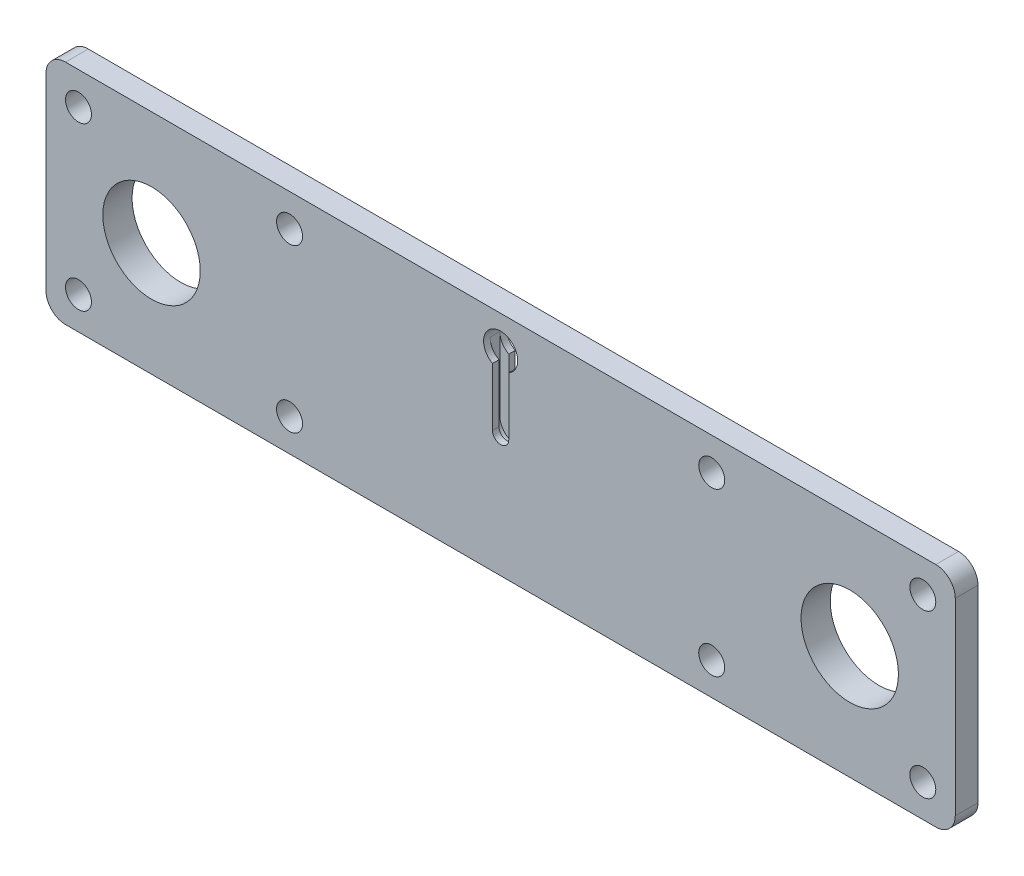
ISO-10303-21;
HEADER;
FILE_DESCRIPTION(('STEP AP214'),'2;1');
FILE_NAME('part.step','',(''),(''),'','','');
FILE_SCHEMA(('AUTOMOTIVE_DESIGN { 1 0 10303 214 1 1 1 1 }'));
ENDSEC;
DATA;
#1=APPLICATION_CONTEXT('core data for automotive mechanical design processes');
#2=APPLICATION_PROTOCOL_DEFINITION('international standard','automotive_design',2000,#1);
#3=PRODUCT_CONTEXT('',#1,'mechanical');
#4=PRODUCT('Part','Part','',(#3));
#5=PRODUCT_RELATED_PRODUCT_CATEGORY('part','',(#4));
#6=PRODUCT_DEFINITION_FORMATION('','',#4);
#7=PRODUCT_DEFINITION_CONTEXT('part definition',#1,'design');
#8=PRODUCT_DEFINITION('design','',#6,#7);
#9=PRODUCT_DEFINITION_SHAPE('','',#8);
#10=(LENGTH_UNIT() NAMED_UNIT(*) SI_UNIT(.MILLI.,.METRE.));
#11=(NAMED_UNIT(*) PLANE_ANGLE_UNIT() SI_UNIT($,.RADIAN.));
#12=(NAMED_UNIT(*) SI_UNIT($,.STERADIAN.) SOLID_ANGLE_UNIT());
#13=UNCERTAINTY_MEASURE_WITH_UNIT(LENGTH_MEASURE(1.E-05),#10,'distance_accuracy_value','');
#14=(GEOMETRIC_REPRESENTATION_CONTEXT(3) GLOBAL_UNCERTAINTY_ASSIGNED_CONTEXT((#13)) GLOBAL_UNIT_ASSIGNED_CONTEXT((#10,
#11,#12)) REPRESENTATION_CONTEXT('',''));
#15=CARTESIAN_POINT('',(0.,0.,0.));
#16=DIRECTION('',(0.,0.,1.));
#17=DIRECTION('',(1.,0.,0.));
#18=AXIS2_PLACEMENT_3D('',#15,#16,#17);
#19=CARTESIAN_POINT('',(0.,2.5,10.));
#20=DIRECTION('',(0.,0.,-1.));
#21=DIRECTION('',(-1.,0.,0.));
#22=AXIS2_PLACEMENT_3D('',#19,#20,#21);
#23=CYLINDRICAL_SURFACE('',#22,2.5);
#24=CARTESIAN_POINT('',(0.,2.5,5.));
#25=DIRECTION('',(0.,0.,-1.));
#26=DIRECTION('',(-1.,0.,0.));
#27=AXIS2_PLACEMENT_3D('',#24,#25,#26);
#28=CIRCLE('',#27,2.5);
#29=CARTESIAN_POINT('',(-2.5,2.5,5.));
#30=VERTEX_POINT('',#29);
#31=CARTESIAN_POINT('',(2.5,2.5,5.));
#32=VERTEX_POINT('',#31);
#33=EDGE_CURVE('E219',#30,#32,#28,.F.);
#34=ORIENTED_EDGE('',*,*,#33,.F.);
#35=DIRECTION('',(0.,0.,-1.));
#36=VECTOR('',#35,1.);
#37=CARTESIAN_POINT('',(-2.5,2.5,10.));
#38=LINE('',#37,#36);
#39=CARTESIAN_POINT('',(-2.5,2.5,7.));
#40=VERTEX_POINT('',#39);
#41=EDGE_CURVE('E266',#40,#30,#38,.T.);
#42=ORIENTED_EDGE('',*,*,#41,.F.);
#43=CARTESIAN_POINT('',(0.,2.5,7.));
#44=DIRECTION('',(0.,0.,1.));
#45=DIRECTION('',(1.,0.,0.));
#46=AXIS2_PLACEMENT_3D('',#43,#44,#45);
#47=CIRCLE('',#46,2.5);
#48=CARTESIAN_POINT('',(2.5,2.5,7.));
#49=VERTEX_POINT('',#48);
#50=EDGE_CURVE('E309',#40,#49,#47,.T.);
#51=ORIENTED_EDGE('',*,*,#50,.T.);
#52=DIRECTION('',(0.,0.,-1.));
#53=VECTOR('',#52,1.);
#54=CARTESIAN_POINT('',(2.5,2.5,10.));
#55=LINE('',#54,#53);
#56=EDGE_CURVE('E245',#49,#32,#55,.T.);
#57=ORIENTED_EDGE('',*,*,#56,.T.);
#58=EDGE_LOOP('',(#34,#42,#51,#57));
#59=FACE_BOUND('',#58,.T.);
#60=ADVANCED_FACE('F37',(#59),#23,.F.);
#61=CARTESIAN_POINT('',(2.5,2.5,10.));
#62=DIRECTION('',(1.,0.,0.));
#63=DIRECTION('',(0.,0.,-1.));
#64=AXIS2_PLACEMENT_3D('',#61,#62,#63);
#65=PLANE('',#64);
#66=DIRECTION('',(0.,1.,0.));
#67=VECTOR('',#66,1.);
#68=CARTESIAN_POINT('',(2.5,2.5,5.));
#69=LINE('',#68,#67);
#70=CARTESIAN_POINT('',(2.5,20.3834536718452,5.));
#71=VERTEX_POINT('',#70);
#72=EDGE_CURVE('E180',#32,#71,#69,.T.);
#73=ORIENTED_EDGE('',*,*,#72,.F.);
#74=ORIENTED_EDGE('',*,*,#56,.F.);
#75=DIRECTION('',(0.,1.,0.));
#76=VECTOR('',#75,1.);
#77=CARTESIAN_POINT('',(2.5,0.,7.));
#78=LINE('',#77,#76);
#79=CARTESIAN_POINT('',(2.5,20.3834536718452,7.));
#80=VERTEX_POINT('',#79);
#81=EDGE_CURVE('E307',#49,#80,#78,.T.);
#82=ORIENTED_EDGE('',*,*,#81,.T.);
#83=DIRECTION('',(0.,0.,-1.));
#84=VECTOR('',#83,1.);
#85=CARTESIAN_POINT('',(2.5,20.3834536718452,10.));
#86=LINE('',#85,#84);
#87=EDGE_CURVE('E261',#80,#71,#86,.T.);
#88=ORIENTED_EDGE('',*,*,#87,.T.);
#89=EDGE_LOOP('',(#73,#74,#82,#88));
#90=FACE_BOUND('',#89,.T.);
#91=ADVANCED_FACE('F421',(#90),#65,.F.);
#92=CARTESIAN_POINT('',(0.,25.,10.));
#93=DIRECTION('',(0.,0.,-1.));
#94=DIRECTION('',(-1.,0.,0.));
#95=AXIS2_PLACEMENT_3D('',#92,#93,#94);
#96=CYLINDRICAL_SURFACE('',#95,5.25);
#97=CARTESIAN_POINT('',(0.,25.,5.));
#98=DIRECTION('',(0.,0.,-1.));
#99=DIRECTION('',(-1.,0.,0.));
#100=AXIS2_PLACEMENT_3D('',#97,#98,#99);
#101=CIRCLE('',#100,5.25);
#102=CARTESIAN_POINT('',(-5.25,25.,5.));
#103=VERTEX_POINT('',#102);
#104=CARTESIAN_POINT('',(-2.5,20.3834536718452,5.));
#105=VERTEX_POINT('',#104);
#106=EDGE_CURVE('E187',#103,#105,#101,.F.);
#107=ORIENTED_EDGE('',*,*,#106,.F.);
#108=DIRECTION('',(0.,0.,-1.));
#109=VECTOR('',#108,1.);
#110=CARTESIAN_POINT('',(-5.25,25.,5.));
#111=LINE('',#110,#109);
#112=CARTESIAN_POINT('',(-5.25,25.,2.));
#113=VERTEX_POINT('',#112);
#114=EDGE_CURVE('E214',#103,#113,#111,.T.);
#115=ORIENTED_EDGE('',*,*,#114,.T.);
#116=CARTESIAN_POINT('',(0.,25.,2.));
#117=DIRECTION('',(0.,0.,-1.));
#118=DIRECTION('',(-1.,0.,0.));
#119=AXIS2_PLACEMENT_3D('',#116,#117,#118);
#120=CIRCLE('',#119,5.25);
#121=CARTESIAN_POINT('',(-2.5,20.3834536718452,2.));
#122=VERTEX_POINT('',#121);
#123=EDGE_CURVE('E211',#113,#122,#120,.F.);
#124=ORIENTED_EDGE('',*,*,#123,.T.);
#125=DIRECTION('',(0.,0.,-1.));
#126=VECTOR('',#125,1.);
#127=CARTESIAN_POINT('',(-2.5,20.3834536718452,10.));
#128=LINE('',#127,#126);
#129=CARTESIAN_POINT('',(-2.5,20.3834536718452,0.));
#130=VERTEX_POINT('',#129);
#131=EDGE_CURVE('E265',#122,#130,#128,.T.);
#132=ORIENTED_EDGE('',*,*,#131,.T.);
#133=CARTESIAN_POINT('',(0.,25.,0.));
#134=DIRECTION('',(0.,0.,-1.));
#135=DIRECTION('',(-1.,0.,0.));
#136=AXIS2_PLACEMENT_3D('',#133,#134,#135);
#137=CIRCLE('',#136,5.25);
#138=CARTESIAN_POINT('',(2.5,20.3834536718452,0.));
#139=VERTEX_POINT('',#138);
#140=EDGE_CURVE('E251',#130,#139,#137,.T.);
#141=ORIENTED_EDGE('',*,*,#140,.T.);
#142=CARTESIAN_POINT('',(2.5,20.3834536718452,2.));
#143=VERTEX_POINT('',#142);
#144=EDGE_CURVE('E263',#143,#139,#86,.T.);
#145=ORIENTED_EDGE('',*,*,#144,.F.);
#146=CARTESIAN_POINT('',(5.25,25.,2.));
#147=VERTEX_POINT('',#146);
#148=EDGE_CURVE('E202',#143,#147,#120,.F.);
#149=ORIENTED_EDGE('',*,*,#148,.T.);
#150=DIRECTION('',(0.,0.,-1.));
#151=VECTOR('',#150,1.);
#152=CARTESIAN_POINT('',(5.25,25.,5.));
#153=LINE('',#152,#151);
#154=CARTESIAN_POINT('',(5.25,25.,5.));
#155=VERTEX_POINT('',#154);
#156=EDGE_CURVE('E191',#155,#147,#153,.T.);
#157=ORIENTED_EDGE('',*,*,#156,.F.);
#158=EDGE_CURVE('E174',#71,#155,#101,.F.);
#159=ORIENTED_EDGE('',*,*,#158,.F.);
#160=ORIENTED_EDGE('',*,*,#87,.F.);
#161=CARTESIAN_POINT('',(0.,25.,7.));
#162=DIRECTION('',(0.,0.,1.));
#163=DIRECTION('',(1.,0.,0.));
#164=AXIS2_PLACEMENT_3D('',#161,#162,#163);
#165=CIRCLE('',#164,5.25);
#166=CARTESIAN_POINT('',(-2.5,20.3834536718452,7.));
#167=VERTEX_POINT('',#166);
#168=EDGE_CURVE('E305',#80,#167,#165,.T.);
#169=ORIENTED_EDGE('',*,*,#168,.T.);
#170=EDGE_CURVE('E60',#167,#105,#128,.T.);
#171=ORIENTED_EDGE('',*,*,#170,.T.);
#172=EDGE_LOOP('',(#107,#115,#124,#132,#141,#145,#149,#157,#159,#160,#169,#171));
#173=FACE_BOUND('',#172,.T.);
#174=ADVANCED_FACE('F200',(#173),#96,.F.);
#175=CARTESIAN_POINT('',(-2.5,2.5,10.));
#176=DIRECTION('',(-1.,0.,0.));
#177=DIRECTION('',(0.,0.,1.));
#178=AXIS2_PLACEMENT_3D('',#175,#176,#177);
#179=PLANE('',#178);
#180=DIRECTION('',(0.,-1.,0.));
#181=VECTOR('',#180,1.);
#182=CARTESIAN_POINT('',(-2.5,2.5,5.));
#183=LINE('',#182,#181);
#184=EDGE_CURVE('E11',#105,#30,#183,.T.);
#185=ORIENTED_EDGE('',*,*,#184,.F.);
#186=ORIENTED_EDGE('',*,*,#170,.F.);
#187=DIRECTION('',(0.,-1.,0.));
#188=VECTOR('',#187,1.);
#189=CARTESIAN_POINT('',(-2.5,0.,7.));
#190=LINE('',#189,#188);
#191=EDGE_CURVE('E303',#167,#40,#190,.T.);
#192=ORIENTED_EDGE('',*,*,#191,.T.);
#193=ORIENTED_EDGE('',*,*,#41,.T.);
#194=EDGE_LOOP('',(#185,#186,#192,#193));
#195=FACE_BOUND('',#194,.T.);
#196=ADVANCED_FACE('F428',(#195),#179,.F.);
#197=CARTESIAN_POINT('',(0.,0.,0.));
#198=DIRECTION('',(0.,0.,1.));
#199=DIRECTION('',(1.,0.,0.));
#200=AXIS2_PLACEMENT_3D('',#197,#198,#199);
#201=PLANE('',#200);
#202=CARTESIAN_POINT('',(107.5,0.,0.));
#203=DIRECTION('',(0.,0.,1.));
#204=DIRECTION('',(1.,0.,0.));
#205=AXIS2_PLACEMENT_3D('',#202,#203,#204);
#206=CIRCLE('',#205,20.);
#207=CARTESIAN_POINT('',(127.5,0.,0.));
#208=VERTEX_POINT('',#207);
#209=EDGE_CURVE('E380',#208,#208,#206,.F.);
#210=ORIENTED_EDGE('',*,*,#209,.F.);
#211=EDGE_LOOP('',(#210));
#212=FACE_BOUND('',#211,.T.);
#213=CARTESIAN_POINT('',(-65.,-25.,0.));
#214=DIRECTION('',(0.,0.,-1.));
#215=DIRECTION('',(1.,0.,0.));
#216=AXIS2_PLACEMENT_3D('',#213,#214,#215);
#217=CIRCLE('',#216,4.00000000000002);
#218=CARTESIAN_POINT('',(-61.,-25.,0.));
#219=VERTEX_POINT('',#218);
#220=EDGE_CURVE('E241',#219,#219,#217,.T.);
#221=ORIENTED_EDGE('',*,*,#220,.F.);
#222=EDGE_LOOP('',(#221));
#223=FACE_BOUND('',#222,.T.);
#224=CARTESIAN_POINT('',(-130.,-25.,0.));
#225=DIRECTION('',(0.,0.,-1.));
#226=DIRECTION('',(1.,0.,0.));
#227=AXIS2_PLACEMENT_3D('',#224,#225,#226);
#228=CIRCLE('',#227,3.99999999999996);
#229=CARTESIAN_POINT('',(-126.,-25.,0.));
#230=VERTEX_POINT('',#229);
#231=EDGE_CURVE('E242',#230,#230,#228,.T.);
#232=ORIENTED_EDGE('',*,*,#231,.F.);
#233=EDGE_LOOP('',(#232));
#234=FACE_BOUND('',#233,.T.);
#235=DIRECTION('',(0.,1.,0.));
#236=VECTOR('',#235,1.);
#237=CARTESIAN_POINT('',(-2.5,2.5,0.));
#238=LINE('',#237,#236);
#239=CARTESIAN_POINT('',(-2.5,2.5,0.));
#240=VERTEX_POINT('',#239);
#241=EDGE_CURVE('E248',#240,#130,#238,.T.);
#242=ORIENTED_EDGE('',*,*,#241,.F.);
#243=CARTESIAN_POINT('',(0.,2.5,0.));
#244=DIRECTION('',(0.,0.,-1.));
#245=DIRECTION('',(-1.,0.,0.));
#246=AXIS2_PLACEMENT_3D('',#243,#244,#245);
#247=CIRCLE('',#246,2.5);
#248=CARTESIAN_POINT('',(2.5,2.5,0.));
#249=VERTEX_POINT('',#248);
#250=EDGE_CURVE('E233',#249,#240,#247,.T.);
#251=ORIENTED_EDGE('',*,*,#250,.F.);
#252=DIRECTION('',(0.,-1.,0.));
#253=VECTOR('',#252,1.);
#254=CARTESIAN_POINT('',(2.5,2.5,0.));
#255=LINE('',#254,#253);
#256=EDGE_CURVE('E254',#139,#249,#255,.T.);
#257=ORIENTED_EDGE('',*,*,#256,.F.);
#258=ORIENTED_EDGE('',*,*,#140,.F.);
#259=EDGE_LOOP('',(#242,#251,#257,#258));
#260=FACE_BOUND('',#259,.T.);
#261=CARTESIAN_POINT('',(65.,-25.,0.));
#262=DIRECTION('',(0.,0.,-1.));
#263=DIRECTION('',(1.,0.,0.));
#264=AXIS2_PLACEMENT_3D('',#261,#262,#263);
#265=CIRCLE('',#264,4.00000000000001);
#266=CARTESIAN_POINT('',(69.,-25.,0.));
#267=VERTEX_POINT('',#266);
#268=EDGE_CURVE('E238',#267,#267,#265,.T.);
#269=ORIENTED_EDGE('',*,*,#268,.F.);
#270=EDGE_LOOP('',(#269));
#271=FACE_BOUND('',#270,.T.);
#272=CARTESIAN_POINT('',(130.,25.,0.));
#273=DIRECTION('',(0.,0.,-1.));
#274=DIRECTION('',(-1.,0.,0.));
#275=AXIS2_PLACEMENT_3D('',#272,#273,#274);
#276=CIRCLE('',#275,3.99999999999999);
#277=CARTESIAN_POINT('',(126.,25.,0.));
#278=VERTEX_POINT('',#277);
#279=EDGE_CURVE('E234',#278,#278,#276,.T.);
#280=ORIENTED_EDGE('',*,*,#279,.F.);
#281=EDGE_LOOP('',(#280));
#282=FACE_BOUND('',#281,.T.);
#283=CARTESIAN_POINT('',(65.,25.,0.));
#284=DIRECTION('',(0.,0.,-1.));
#285=DIRECTION('',(-1.,0.,0.));
#286=AXIS2_PLACEMENT_3D('',#283,#284,#285);
#287=CIRCLE('',#286,4.00000000000001);
#288=CARTESIAN_POINT('',(61.,25.,0.));
#289=VERTEX_POINT('',#288);
#290=EDGE_CURVE('E237',#289,#289,#287,.T.);
#291=ORIENTED_EDGE('',*,*,#290,.F.);
#292=EDGE_LOOP('',(#291));
#293=FACE_BOUND('',#292,.T.);
#294=CARTESIAN_POINT('',(-65.,25.,0.));
#295=DIRECTION('',(0.,0.,-1.));
#296=DIRECTION('',(-1.,0.,0.));
#297=AXIS2_PLACEMENT_3D('',#294,#295,#296);
#298=CIRCLE('',#297,4.00000000000002);
#299=CARTESIAN_POINT('',(-69.,25.,0.));
#300=VERTEX_POINT('',#299);
#301=EDGE_CURVE('E278',#300,#300,#298,.T.);
#302=ORIENTED_EDGE('',*,*,#301,.F.);
#303=EDGE_LOOP('',(#302));
#304=FACE_BOUND('',#303,.T.);
#305=CARTESIAN_POINT('',(130.,-25.,0.));
#306=DIRECTION('',(0.,0.,-1.));
#307=DIRECTION('',(1.,0.,0.));
#308=AXIS2_PLACEMENT_3D('',#305,#306,#307);
#309=CIRCLE('',#308,3.99999999999999);
#310=CARTESIAN_POINT('',(134.,-25.,0.));
#311=VERTEX_POINT('',#310);
#312=EDGE_CURVE('E275',#311,#311,#309,.T.);
#313=ORIENTED_EDGE('',*,*,#312,.F.);
#314=EDGE_LOOP('',(#313));
#315=FACE_BOUND('',#314,.T.);
#316=CARTESIAN_POINT('',(-130.,25.,0.));
#317=DIRECTION('',(0.,0.,-1.));
#318=DIRECTION('',(-1.,0.,0.));
#319=AXIS2_PLACEMENT_3D('',#316,#317,#318);
#320=CIRCLE('',#319,3.99999999999996);
#321=CARTESIAN_POINT('',(-134.,25.,0.));
#322=VERTEX_POINT('',#321);
#323=EDGE_CURVE('E271',#322,#322,#320,.T.);
#324=ORIENTED_EDGE('',*,*,#323,.F.);
#325=EDGE_LOOP('',(#324));
#326=FACE_BOUND('',#325,.T.);
#327=DIRECTION('',(0.,1.,0.));
#328=VECTOR('',#327,1.);
#329=CARTESIAN_POINT('',(140.,35.,0.));
#330=LINE('',#329,#328);
#331=CARTESIAN_POINT('',(140.,-29.,0.));
#332=VERTEX_POINT('',#331);
#333=CARTESIAN_POINT('',(140.,29.,0.));
#334=VERTEX_POINT('',#333);
#335=EDGE_CURVE('E320',#332,#334,#330,.T.);
#336=ORIENTED_EDGE('',*,*,#335,.F.);
#337=CARTESIAN_POINT('',(134.,-29.,0.));
#338=DIRECTION('',(0.,0.,1.));
#339=DIRECTION('',(1.,0.,0.));
#340=AXIS2_PLACEMENT_3D('',#337,#338,#339);
#341=CIRCLE('',#340,6.);
#342=CARTESIAN_POINT('',(134.,-35.,0.));
#343=VERTEX_POINT('',#342);
#344=EDGE_CURVE('E355',#332,#343,#341,.F.);
#345=ORIENTED_EDGE('',*,*,#344,.T.);
#346=DIRECTION('',(1.,0.,0.));
#347=VECTOR('',#346,1.);
#348=CARTESIAN_POINT('',(-140.,-35.,0.));
#349=LINE('',#348,#347);
#350=CARTESIAN_POINT('',(-134.,-35.,0.));
#351=VERTEX_POINT('',#350);
#352=EDGE_CURVE('E325',#351,#343,#349,.T.);
#353=ORIENTED_EDGE('',*,*,#352,.F.);
#354=CARTESIAN_POINT('',(-134.,-29.,0.));
#355=DIRECTION('',(0.,0.,1.));
#356=DIRECTION('',(1.,0.,0.));
#357=AXIS2_PLACEMENT_3D('',#354,#355,#356);
#358=CIRCLE('',#357,6.);
#359=CARTESIAN_POINT('',(-140.,-29.,0.));
#360=VERTEX_POINT('',#359);
#361=EDGE_CURVE('E351',#351,#360,#358,.F.);
#362=ORIENTED_EDGE('',*,*,#361,.T.);
#363=DIRECTION('',(0.,-1.,0.));
#364=VECTOR('',#363,1.);
#365=CARTESIAN_POINT('',(-140.,35.,0.));
#366=LINE('',#365,#364);
#367=CARTESIAN_POINT('',(-140.,29.,0.));
#368=VERTEX_POINT('',#367);
#369=EDGE_CURVE('E340',#368,#360,#366,.T.);
#370=ORIENTED_EDGE('',*,*,#369,.F.);
#371=CARTESIAN_POINT('',(-134.,29.,0.));
#372=DIRECTION('',(0.,0.,1.));
#373=DIRECTION('',(1.,0.,0.));
#374=AXIS2_PLACEMENT_3D('',#371,#372,#373);
#375=CIRCLE('',#374,6.);
#376=CARTESIAN_POINT('',(-134.,35.,0.));
#377=VERTEX_POINT('',#376);
#378=EDGE_CURVE('E349',#368,#377,#375,.F.);
#379=ORIENTED_EDGE('',*,*,#378,.T.);
#380=DIRECTION('',(-1.,0.,0.));
#381=VECTOR('',#380,1.);
#382=CARTESIAN_POINT('',(-140.,35.,0.));
#383=LINE('',#382,#381);
#384=CARTESIAN_POINT('',(134.,35.,0.));
#385=VERTEX_POINT('',#384);
#386=EDGE_CURVE('E337',#385,#377,#383,.T.);
#387=ORIENTED_EDGE('',*,*,#386,.F.);
#388=CARTESIAN_POINT('',(134.,29.,0.));
#389=DIRECTION('',(0.,0.,1.));
#390=DIRECTION('',(1.,0.,0.));
#391=AXIS2_PLACEMENT_3D('',#388,#389,#390);
#392=CIRCLE('',#391,6.);
#393=EDGE_CURVE('E353',#385,#334,#392,.F.);
#394=ORIENTED_EDGE('',*,*,#393,.T.);
#395=EDGE_LOOP('',(#336,#345,#353,#362,#370,#379,#387,#394));
#396=FACE_BOUND('',#395,.T.);
#397=CARTESIAN_POINT('',(-107.5,0.,0.));
#398=DIRECTION('',(0.,0.,1.));
#399=DIRECTION('',(1.,0.,0.));
#400=AXIS2_PLACEMENT_3D('',#397,#398,#399);
#401=CIRCLE('',#400,20.);
#402=CARTESIAN_POINT('',(-87.5,0.,0.));
#403=VERTEX_POINT('',#402);
#404=EDGE_CURVE('E383',#403,#403,#401,.F.);
#405=ORIENTED_EDGE('',*,*,#404,.F.);
#406=EDGE_LOOP('',(#405));
#407=FACE_BOUND('',#406,.T.);
#408=ADVANCED_FACE('F397',(#212,#223,#234,#260,#271,#282,#293,#304,#315,#326,#396,#407),#201,.F.);
#409=CARTESIAN_POINT('',(140.,35.,7.));
#410=DIRECTION('',(-1.,0.,0.));
#411=DIRECTION('',(0.,0.,1.));
#412=AXIS2_PLACEMENT_3D('',#409,#410,#411);
#413=PLANE('',#412);
#414=DIRECTION('',(0.,1.,0.));
#415=VECTOR('',#414,1.);
#416=CARTESIAN_POINT('',(140.,35.,7.));
#417=LINE('',#416,#415);
#418=CARTESIAN_POINT('',(140.,-29.,7.));
#419=VERTEX_POINT('',#418);
#420=CARTESIAN_POINT('',(140.,29.,7.));
#421=VERTEX_POINT('',#420);
#422=EDGE_CURVE('E321',#419,#421,#417,.T.);
#423=ORIENTED_EDGE('',*,*,#422,.F.);
#424=DIRECTION('',(0.,0.,-1.));
#425=VECTOR('',#424,1.);
#426=CARTESIAN_POINT('',(140.,-29.,7.));
#427=LINE('',#426,#425);
#428=EDGE_CURVE('E346',#419,#332,#427,.T.);
#429=ORIENTED_EDGE('',*,*,#428,.T.);
#430=ORIENTED_EDGE('',*,*,#335,.T.);
#431=DIRECTION('',(0.,0.,-1.));
#432=VECTOR('',#431,1.);
#433=CARTESIAN_POINT('',(140.,29.,7.));
#434=LINE('',#433,#432);
#435=EDGE_CURVE('E334',#334,#421,#434,.F.);
#436=ORIENTED_EDGE('',*,*,#435,.T.);
#437=EDGE_LOOP('',(#423,#429,#430,#436));
#438=FACE_BOUND('',#437,.T.);
#439=ADVANCED_FACE('F479',(#438),#413,.F.);
#440=CARTESIAN_POINT('',(-140.,35.,7.));
#441=DIRECTION('',(0.,-1.,0.));
#442=DIRECTION('',(0.,0.,-1.));
#443=AXIS2_PLACEMENT_3D('',#440,#441,#442);
#444=PLANE('',#443);
#445=DIRECTION('',(-1.,0.,0.));
#446=VECTOR('',#445,1.);
#447=CARTESIAN_POINT('',(-140.,35.,7.));
#448=LINE('',#447,#446);
#449=CARTESIAN_POINT('',(134.,35.,7.));
#450=VERTEX_POINT('',#449);
#451=CARTESIAN_POINT('',(-134.,35.,7.));
#452=VERTEX_POINT('',#451);
#453=EDGE_CURVE('E324',#450,#452,#448,.T.);
#454=ORIENTED_EDGE('',*,*,#453,.F.);
#455=DIRECTION('',(0.,0.,-1.));
#456=VECTOR('',#455,1.);
#457=CARTESIAN_POINT('',(134.,35.,7.));
#458=LINE('',#457,#456);
#459=EDGE_CURVE('E372',#450,#385,#458,.T.);
#460=ORIENTED_EDGE('',*,*,#459,.T.);
#461=ORIENTED_EDGE('',*,*,#386,.T.);
#462=DIRECTION('',(0.,0.,-1.));
#463=VECTOR('',#462,1.);
#464=CARTESIAN_POINT('',(-134.,35.,7.));
#465=LINE('',#464,#463);
#466=EDGE_CURVE('E370',#377,#452,#465,.F.);
#467=ORIENTED_EDGE('',*,*,#466,.T.);
#468=EDGE_LOOP('',(#454,#460,#461,#467));
#469=FACE_BOUND('',#468,.T.);
#470=ADVANCED_FACE('F487',(#469),#444,.F.);
#471=CARTESIAN_POINT('',(-140.,35.,7.));
#472=DIRECTION('',(1.,0.,0.));
#473=DIRECTION('',(0.,0.,-1.));
#474=AXIS2_PLACEMENT_3D('',#471,#472,#473);
#475=PLANE('',#474);
#476=ORIENTED_EDGE('',*,*,#369,.T.);
#477=DIRECTION('',(0.,0.,-1.));
#478=VECTOR('',#477,1.);
#479=CARTESIAN_POINT('',(-140.,-29.,7.));
#480=LINE('',#479,#478);
#481=CARTESIAN_POINT('',(-140.,-29.,7.));
#482=VERTEX_POINT('',#481);
#483=EDGE_CURVE('E378',#360,#482,#480,.F.);
#484=ORIENTED_EDGE('',*,*,#483,.T.);
#485=DIRECTION('',(0.,-1.,0.));
#486=VECTOR('',#485,1.);
#487=CARTESIAN_POINT('',(-140.,35.,7.));
#488=LINE('',#487,#486);
#489=CARTESIAN_POINT('',(-140.,29.,7.));
#490=VERTEX_POINT('',#489);
#491=EDGE_CURVE('E328',#490,#482,#488,.T.);
#492=ORIENTED_EDGE('',*,*,#491,.F.);
#493=DIRECTION('',(0.,0.,-1.));
#494=VECTOR('',#493,1.);
#495=CARTESIAN_POINT('',(-140.,29.,7.));
#496=LINE('',#495,#494);
#497=EDGE_CURVE('E375',#490,#368,#496,.T.);
#498=ORIENTED_EDGE('',*,*,#497,.T.);
#499=EDGE_LOOP('',(#476,#484,#492,#498));
#500=FACE_BOUND('',#499,.T.);
#501=ADVANCED_FACE('F483',(#500),#475,.F.);
#502=CARTESIAN_POINT('',(-140.,-35.,7.));
#503=DIRECTION('',(0.,1.,0.));
#504=DIRECTION('',(0.,0.,1.));
#505=AXIS2_PLACEMENT_3D('',#502,#503,#504);
#506=PLANE('',#505);
#507=ORIENTED_EDGE('',*,*,#352,.T.);
#508=DIRECTION('',(0.,0.,-1.));
#509=VECTOR('',#508,1.);
#510=CARTESIAN_POINT('',(134.,-35.,7.));
#511=LINE('',#510,#509);
#512=CARTESIAN_POINT('',(134.,-35.,7.));
#513=VERTEX_POINT('',#512);
#514=EDGE_CURVE('E360',#343,#513,#511,.F.);
#515=ORIENTED_EDGE('',*,*,#514,.T.);
#516=DIRECTION('',(1.,0.,0.));
#517=VECTOR('',#516,1.);
#518=CARTESIAN_POINT('',(-140.,-35.,7.));
#519=LINE('',#518,#517);
#520=CARTESIAN_POINT('',(-134.,-35.,7.));
#521=VERTEX_POINT('',#520);
#522=EDGE_CURVE('E331',#521,#513,#519,.T.);
#523=ORIENTED_EDGE('',*,*,#522,.F.);
#524=DIRECTION('',(0.,0.,-1.));
#525=VECTOR('',#524,1.);
#526=CARTESIAN_POINT('',(-134.,-35.,7.));
#527=LINE('',#526,#525);
#528=EDGE_CURVE('E357',#521,#351,#527,.T.);
#529=ORIENTED_EDGE('',*,*,#528,.T.);
#530=EDGE_LOOP('',(#507,#515,#523,#529));
#531=FACE_BOUND('',#530,.T.);
#532=ADVANCED_FACE('F475',(#531),#506,.F.);
#533=CARTESIAN_POINT('',(0.,0.,7.));
#534=DIRECTION('',(0.,0.,1.));
#535=DIRECTION('',(1.,0.,0.));
#536=AXIS2_PLACEMENT_3D('',#533,#534,#535);
#537=PLANE('',#536);
#538=CARTESIAN_POINT('',(-65.,-25.,7.));
#539=DIRECTION('',(0.,0.,1.));
#540=DIRECTION('',(1.,0.,0.));
#541=AXIS2_PLACEMENT_3D('',#538,#539,#540);
#542=CIRCLE('',#541,4.00000000000002);
#543=CARTESIAN_POINT('',(-61.,-25.,7.));
#544=VERTEX_POINT('',#543);
#545=EDGE_CURVE('E314',#544,#544,#542,.T.);
#546=ORIENTED_EDGE('',*,*,#545,.F.);
#547=EDGE_LOOP('',(#546));
#548=FACE_BOUND('',#547,.T.);
#549=CARTESIAN_POINT('',(-130.,-25.,7.));
#550=DIRECTION('',(0.,0.,1.));
#551=DIRECTION('',(1.,0.,0.));
#552=AXIS2_PLACEMENT_3D('',#549,#550,#551);
#553=CIRCLE('',#552,3.99999999999996);
#554=CARTESIAN_POINT('',(-126.,-25.,7.));
#555=VERTEX_POINT('',#554);
#556=EDGE_CURVE('E311',#555,#555,#553,.T.);
#557=ORIENTED_EDGE('',*,*,#556,.F.);
#558=EDGE_LOOP('',(#557));
#559=FACE_BOUND('',#558,.T.);
#560=ORIENTED_EDGE('',*,*,#50,.F.);
#561=ORIENTED_EDGE('',*,*,#191,.F.);
#562=ORIENTED_EDGE('',*,*,#168,.F.);
#563=ORIENTED_EDGE('',*,*,#81,.F.);
#564=EDGE_LOOP('',(#560,#561,#562,#563));
#565=FACE_BOUND('',#564,.T.);
#566=CARTESIAN_POINT('',(65.,-25.,7.));
#567=DIRECTION('',(0.,0.,1.));
#568=DIRECTION('',(1.,0.,0.));
#569=AXIS2_PLACEMENT_3D('',#566,#567,#568);
#570=CIRCLE('',#569,4.00000000000001);
#571=CARTESIAN_POINT('',(69.,-25.,7.));
#572=VERTEX_POINT('',#571);
#573=EDGE_CURVE('E300',#572,#572,#570,.T.);
#574=ORIENTED_EDGE('',*,*,#573,.F.);
#575=EDGE_LOOP('',(#574));
#576=FACE_BOUND('',#575,.T.);
#577=CARTESIAN_POINT('',(130.,25.,7.));
#578=DIRECTION('',(0.,0.,1.));
#579=DIRECTION('',(1.,0.,0.));
#580=AXIS2_PLACEMENT_3D('',#577,#578,#579);
#581=CIRCLE('',#580,3.99999999999999);
#582=CARTESIAN_POINT('',(134.,25.,7.));
#583=VERTEX_POINT('',#582);
#584=EDGE_CURVE('E297',#583,#583,#581,.T.);
#585=ORIENTED_EDGE('',*,*,#584,.F.);
#586=EDGE_LOOP('',(#585));
#587=FACE_BOUND('',#586,.T.);
#588=CARTESIAN_POINT('',(65.,25.,7.));
#589=DIRECTION('',(0.,0.,1.));
#590=DIRECTION('',(1.,0.,0.));
#591=AXIS2_PLACEMENT_3D('',#588,#589,#590);
#592=CIRCLE('',#591,4.00000000000001);
#593=CARTESIAN_POINT('',(69.,25.,7.));
#594=VERTEX_POINT('',#593);
#595=EDGE_CURVE('E294',#594,#594,#592,.T.);
#596=ORIENTED_EDGE('',*,*,#595,.F.);
#597=EDGE_LOOP('',(#596));
#598=FACE_BOUND('',#597,.T.);
#599=CARTESIAN_POINT('',(-65.,25.,7.));
#600=DIRECTION('',(0.,0.,1.));
#601=DIRECTION('',(1.,0.,0.));
#602=AXIS2_PLACEMENT_3D('',#599,#600,#601);
#603=CIRCLE('',#602,4.00000000000002);
#604=CARTESIAN_POINT('',(-61.,25.,7.));
#605=VERTEX_POINT('',#604);
#606=EDGE_CURVE('E291',#605,#605,#603,.T.);
#607=ORIENTED_EDGE('',*,*,#606,.F.);
#608=EDGE_LOOP('',(#607));
#609=FACE_BOUND('',#608,.T.);
#610=CARTESIAN_POINT('',(130.,-25.,7.));
#611=DIRECTION('',(0.,0.,1.));
#612=DIRECTION('',(1.,0.,0.));
#613=AXIS2_PLACEMENT_3D('',#610,#611,#612);
#614=CIRCLE('',#613,3.99999999999999);
#615=CARTESIAN_POINT('',(134.,-25.,7.));
#616=VERTEX_POINT('',#615);
#617=EDGE_CURVE('E288',#616,#616,#614,.T.);
#618=ORIENTED_EDGE('',*,*,#617,.F.);
#619=EDGE_LOOP('',(#618));
#620=FACE_BOUND('',#619,.T.);
#621=CARTESIAN_POINT('',(-130.,25.,7.));
#622=DIRECTION('',(0.,0.,1.));
#623=DIRECTION('',(1.,0.,0.));
#624=AXIS2_PLACEMENT_3D('',#621,#622,#623);
#625=CIRCLE('',#624,3.99999999999996);
#626=CARTESIAN_POINT('',(-126.,25.,7.));
#627=VERTEX_POINT('',#626);
#628=EDGE_CURVE('E285',#627,#627,#625,.T.);
#629=ORIENTED_EDGE('',*,*,#628,.F.);
#630=EDGE_LOOP('',(#629));
#631=FACE_BOUND('',#630,.T.);
#632=CARTESIAN_POINT('',(-107.5,0.,7.));
#633=DIRECTION('',(0.,0.,1.));
#634=DIRECTION('',(1.,0.,0.));
#635=AXIS2_PLACEMENT_3D('',#632,#633,#634);
#636=CIRCLE('',#635,15.);
#637=CARTESIAN_POINT('',(-92.5,0.,7.));
#638=VERTEX_POINT('',#637);
#639=EDGE_CURVE('E274',#638,#638,#636,.T.);
#640=ORIENTED_EDGE('',*,*,#639,.F.);
#641=EDGE_LOOP('',(#640));
#642=FACE_BOUND('',#641,.T.);
#643=CARTESIAN_POINT('',(107.5,0.,7.));
#644=DIRECTION('',(0.,0.,1.));
#645=DIRECTION('',(1.,0.,0.));
#646=AXIS2_PLACEMENT_3D('',#643,#644,#645);
#647=CIRCLE('',#646,15.);
#648=CARTESIAN_POINT('',(122.5,0.,7.));
#649=VERTEX_POINT('',#648);
#650=EDGE_CURVE('E317',#649,#649,#647,.T.);
#651=ORIENTED_EDGE('',*,*,#650,.F.);
#652=EDGE_LOOP('',(#651));
#653=FACE_BOUND('',#652,.T.);
#654=ORIENTED_EDGE('',*,*,#522,.T.);
#655=CARTESIAN_POINT('',(134.,-29.,7.));
#656=DIRECTION('',(0.,0.,1.));
#657=DIRECTION('',(1.,0.,0.));
#658=AXIS2_PLACEMENT_3D('',#655,#656,#657);
#659=CIRCLE('',#658,6.);
#660=EDGE_CURVE('E368',#513,#419,#659,.T.);
#661=ORIENTED_EDGE('',*,*,#660,.T.);
#662=ORIENTED_EDGE('',*,*,#422,.T.);
#663=CARTESIAN_POINT('',(134.,29.,7.));
#664=DIRECTION('',(0.,0.,1.));
#665=DIRECTION('',(1.,0.,0.));
#666=AXIS2_PLACEMENT_3D('',#663,#664,#665);
#667=CIRCLE('',#666,6.);
#668=EDGE_CURVE('E366',#421,#450,#667,.T.);
#669=ORIENTED_EDGE('',*,*,#668,.T.);
#670=ORIENTED_EDGE('',*,*,#453,.T.);
#671=CARTESIAN_POINT('',(-134.,29.,7.));
#672=DIRECTION('',(0.,0.,1.));
#673=DIRECTION('',(1.,0.,0.));
#674=AXIS2_PLACEMENT_3D('',#671,#672,#673);
#675=CIRCLE('',#674,6.);
#676=EDGE_CURVE('E362',#452,#490,#675,.T.);
#677=ORIENTED_EDGE('',*,*,#676,.T.);
#678=ORIENTED_EDGE('',*,*,#491,.T.);
#679=CARTESIAN_POINT('',(-134.,-29.,7.));
#680=DIRECTION('',(0.,0.,1.));
#681=DIRECTION('',(1.,0.,0.));
#682=AXIS2_PLACEMENT_3D('',#679,#680,#681);
#683=CIRCLE('',#682,6.);
#684=EDGE_CURVE('E364',#482,#521,#683,.T.);
#685=ORIENTED_EDGE('',*,*,#684,.T.);
#686=EDGE_LOOP('',(#654,#661,#662,#669,#670,#677,#678,#685));
#687=FACE_BOUND('',#686,.T.);
#688=ADVANCED_FACE('F471',(#548,#559,#565,#576,#587,#598,#609,#620,#631,#642,#653,#687),#537,.T.);
#689=CARTESIAN_POINT('',(134.,-29.,7.));
#690=DIRECTION('',(0.,0.,-1.));
#691=DIRECTION('',(-1.,0.,0.));
#692=AXIS2_PLACEMENT_3D('',#689,#690,#691);
#693=CYLINDRICAL_SURFACE('',#692,6.);
#694=ORIENTED_EDGE('',*,*,#660,.F.);
#695=ORIENTED_EDGE('',*,*,#514,.F.);
#696=ORIENTED_EDGE('',*,*,#344,.F.);
#697=ORIENTED_EDGE('',*,*,#428,.F.);
#698=EDGE_LOOP('',(#694,#695,#696,#697));
#699=FACE_BOUND('',#698,.T.);
#700=ADVANCED_FACE('F474',(#699),#693,.T.);
#701=CARTESIAN_POINT('',(134.,29.,7.));
#702=DIRECTION('',(0.,0.,-1.));
#703=DIRECTION('',(-1.,0.,0.));
#704=AXIS2_PLACEMENT_3D('',#701,#702,#703);
#705=CYLINDRICAL_SURFACE('',#704,6.);
#706=ORIENTED_EDGE('',*,*,#668,.F.);
#707=ORIENTED_EDGE('',*,*,#435,.F.);
#708=ORIENTED_EDGE('',*,*,#393,.F.);
#709=ORIENTED_EDGE('',*,*,#459,.F.);
#710=EDGE_LOOP('',(#706,#707,#708,#709));
#711=FACE_BOUND('',#710,.T.);
#712=ADVANCED_FACE('F497',(#711),#705,.T.);
#713=CARTESIAN_POINT('',(-134.,-29.,7.));
#714=DIRECTION('',(0.,0.,-1.));
#715=DIRECTION('',(-1.,0.,0.));
#716=AXIS2_PLACEMENT_3D('',#713,#714,#715);
#717=CYLINDRICAL_SURFACE('',#716,6.);
#718=ORIENTED_EDGE('',*,*,#684,.F.);
#719=ORIENTED_EDGE('',*,*,#483,.F.);
#720=ORIENTED_EDGE('',*,*,#361,.F.);
#721=ORIENTED_EDGE('',*,*,#528,.F.);
#722=EDGE_LOOP('',(#718,#719,#720,#721));
#723=FACE_BOUND('',#722,.T.);
#724=ADVANCED_FACE('F500',(#723),#717,.T.);
#725=CARTESIAN_POINT('',(-134.,29.,7.));
#726=DIRECTION('',(0.,0.,-1.));
#727=DIRECTION('',(-1.,0.,0.));
#728=AXIS2_PLACEMENT_3D('',#725,#726,#727);
#729=CYLINDRICAL_SURFACE('',#728,6.);
#730=ORIENTED_EDGE('',*,*,#676,.F.);
#731=ORIENTED_EDGE('',*,*,#466,.F.);
#732=ORIENTED_EDGE('',*,*,#378,.F.);
#733=ORIENTED_EDGE('',*,*,#497,.F.);
#734=EDGE_LOOP('',(#730,#731,#732,#733));
#735=FACE_BOUND('',#734,.T.);
#736=ADVANCED_FACE('F39',(#735),#729,.T.);
#737=CARTESIAN_POINT('',(107.5,0.,10.));
#738=DIRECTION('',(0.,0.,-1.));
#739=DIRECTION('',(-1.,0.,0.));
#740=AXIS2_PLACEMENT_3D('',#737,#738,#739);
#741=CYLINDRICAL_SURFACE('',#740,15.);
#742=ORIENTED_EDGE('',*,*,#650,.T.);
#743=EDGE_LOOP('',(#742));
#744=FACE_BOUND('',#743,.T.);
#745=CARTESIAN_POINT('',(107.5,0.,-2.));
#746=DIRECTION('',(0.,0.,-1.));
#747=DIRECTION('',(-1.,0.,0.));
#748=AXIS2_PLACEMENT_3D('',#745,#746,#747);
#749=CIRCLE('',#748,15.);
#750=CARTESIAN_POINT('',(92.5,0.,-2.));
#751=VERTEX_POINT('',#750);
#752=EDGE_CURVE('E227',#751,#751,#749,.T.);
#753=ORIENTED_EDGE('',*,*,#752,.T.);
#754=EDGE_LOOP('',(#753));
#755=FACE_BOUND('',#754,.T.);
#756=ADVANCED_FACE('F450',(#744,#755),#741,.F.);
#757=CARTESIAN_POINT('',(-107.5,0.,10.));
#758=DIRECTION('',(0.,0.,-1.));
#759=DIRECTION('',(-1.,0.,0.));
#760=AXIS2_PLACEMENT_3D('',#757,#758,#759);
#761=CYLINDRICAL_SURFACE('',#760,15.);
#762=ORIENTED_EDGE('',*,*,#639,.T.);
#763=EDGE_LOOP('',(#762));
#764=FACE_BOUND('',#763,.T.);
#765=CARTESIAN_POINT('',(-107.5,0.,-2.));
#766=DIRECTION('',(0.,0.,-1.));
#767=DIRECTION('',(-1.,0.,0.));
#768=AXIS2_PLACEMENT_3D('',#765,#766,#767);
#769=CIRCLE('',#768,15.);
#770=CARTESIAN_POINT('',(-122.5,0.,-2.));
#771=VERTEX_POINT('',#770);
#772=EDGE_CURVE('E185',#771,#771,#769,.T.);
#773=ORIENTED_EDGE('',*,*,#772,.T.);
#774=EDGE_LOOP('',(#773));
#775=FACE_BOUND('',#774,.T.);
#776=ADVANCED_FACE('F446',(#764,#775),#761,.F.);
#777=CARTESIAN_POINT('',(-130.,25.,10.));
#778=DIRECTION('',(0.,0.,-1.));
#779=DIRECTION('',(-1.,0.,0.));
#780=AXIS2_PLACEMENT_3D('',#777,#778,#779);
#781=CYLINDRICAL_SURFACE('',#780,3.99999999999996);
#782=ORIENTED_EDGE('',*,*,#628,.T.);
#783=EDGE_LOOP('',(#782));
#784=FACE_BOUND('',#783,.T.);
#785=ORIENTED_EDGE('',*,*,#323,.T.);
#786=EDGE_LOOP('',(#785));
#787=FACE_BOUND('',#786,.T.);
#788=ADVANCED_FACE('F449',(#784,#787),#781,.F.);
#789=CARTESIAN_POINT('',(130.,-25.,10.));
#790=DIRECTION('',(0.,0.,-1.));
#791=DIRECTION('',(-1.,0.,0.));
#792=AXIS2_PLACEMENT_3D('',#789,#790,#791);
#793=CYLINDRICAL_SURFACE('',#792,3.99999999999999);
#794=ORIENTED_EDGE('',*,*,#617,.T.);
#795=EDGE_LOOP('',(#794));
#796=FACE_BOUND('',#795,.T.);
#797=ORIENTED_EDGE('',*,*,#312,.T.);
#798=EDGE_LOOP('',(#797));
#799=FACE_BOUND('',#798,.T.);
#800=ADVANCED_FACE('F454',(#796,#799),#793,.F.);
#801=CARTESIAN_POINT('',(-65.,25.,10.));
#802=DIRECTION('',(0.,0.,-1.));
#803=DIRECTION('',(-1.,0.,0.));
#804=AXIS2_PLACEMENT_3D('',#801,#802,#803);
#805=CYLINDRICAL_SURFACE('',#804,4.00000000000002);
#806=ORIENTED_EDGE('',*,*,#606,.T.);
#807=EDGE_LOOP('',(#806));
#808=FACE_BOUND('',#807,.T.);
#809=ORIENTED_EDGE('',*,*,#301,.T.);
#810=EDGE_LOOP('',(#809));
#811=FACE_BOUND('',#810,.T.);
#812=ADVANCED_FACE('F458',(#808,#811),#805,.F.);
#813=CARTESIAN_POINT('',(65.,25.,10.));
#814=DIRECTION('',(0.,0.,-1.));
#815=DIRECTION('',(-1.,0.,0.));
#816=AXIS2_PLACEMENT_3D('',#813,#814,#815);
#817=CYLINDRICAL_SURFACE('',#816,4.00000000000001);
#818=ORIENTED_EDGE('',*,*,#595,.T.);
#819=EDGE_LOOP('',(#818));
#820=FACE_BOUND('',#819,.T.);
#821=ORIENTED_EDGE('',*,*,#290,.T.);
#822=EDGE_LOOP('',(#821));
#823=FACE_BOUND('',#822,.T.);
#824=ADVANCED_FACE('F462',(#820,#823),#817,.F.);
#825=CARTESIAN_POINT('',(130.,25.,10.));
#826=DIRECTION('',(0.,0.,-1.));
#827=DIRECTION('',(-1.,0.,0.));
#828=AXIS2_PLACEMENT_3D('',#825,#826,#827);
#829=CYLINDRICAL_SURFACE('',#828,3.99999999999999);
#830=ORIENTED_EDGE('',*,*,#584,.T.);
#831=EDGE_LOOP('',(#830));
#832=FACE_BOUND('',#831,.T.);
#833=ORIENTED_EDGE('',*,*,#279,.T.);
#834=EDGE_LOOP('',(#833));
#835=FACE_BOUND('',#834,.T.);
#836=ADVANCED_FACE('F466',(#832,#835),#829,.F.);
#837=CARTESIAN_POINT('',(65.,-25.,10.));
#838=DIRECTION('',(0.,0.,-1.));
#839=DIRECTION('',(-1.,0.,0.));
#840=AXIS2_PLACEMENT_3D('',#837,#838,#839);
#841=CYLINDRICAL_SURFACE('',#840,4.00000000000001);
#842=ORIENTED_EDGE('',*,*,#573,.T.);
#843=EDGE_LOOP('',(#842));
#844=FACE_BOUND('',#843,.T.);
#845=ORIENTED_EDGE('',*,*,#268,.T.);
#846=EDGE_LOOP('',(#845));
#847=FACE_BOUND('',#846,.T.);
#848=ADVANCED_FACE('F429',(#844,#847),#841,.F.);
#849=CARTESIAN_POINT('',(-2.5,2.5,2.));
#850=VERTEX_POINT('',#849);
#851=EDGE_CURVE('E257',#850,#240,#38,.T.);
#852=ORIENTED_EDGE('',*,*,#851,.F.);
#853=CARTESIAN_POINT('',(0.,2.5,2.));
#854=DIRECTION('',(0.,0.,-1.));
#855=DIRECTION('',(-1.,0.,0.));
#856=AXIS2_PLACEMENT_3D('',#853,#854,#855);
#857=CIRCLE('',#856,2.5);
#858=CARTESIAN_POINT('',(2.5,2.5,2.));
#859=VERTEX_POINT('',#858);
#860=EDGE_CURVE('E52',#850,#859,#857,.F.);
#861=ORIENTED_EDGE('',*,*,#860,.T.);
#862=EDGE_CURVE('E260',#859,#249,#55,.T.);
#863=ORIENTED_EDGE('',*,*,#862,.T.);
#864=ORIENTED_EDGE('',*,*,#250,.T.);
#865=EDGE_LOOP('',(#852,#861,#863,#864));
#866=FACE_BOUND('',#865,.T.);
#867=ADVANCED_FACE('F390',(#866),#23,.F.);
#868=ORIENTED_EDGE('',*,*,#862,.F.);
#869=DIRECTION('',(0.,1.,0.));
#870=VECTOR('',#869,1.);
#871=CARTESIAN_POINT('',(2.5,2.5,2.));
#872=LINE('',#871,#870);
#873=EDGE_CURVE('E216',#859,#143,#872,.T.);
#874=ORIENTED_EDGE('',*,*,#873,.T.);
#875=ORIENTED_EDGE('',*,*,#144,.T.);
#876=ORIENTED_EDGE('',*,*,#256,.T.);
#877=EDGE_LOOP('',(#868,#874,#875,#876));
#878=FACE_BOUND('',#877,.T.);
#879=ADVANCED_FACE('F418',(#878),#65,.F.);
#880=ORIENTED_EDGE('',*,*,#131,.F.);
#881=DIRECTION('',(0.,-1.,0.));
#882=VECTOR('',#881,1.);
#883=CARTESIAN_POINT('',(-2.5,2.5,2.));
#884=LINE('',#883,#882);
#885=EDGE_CURVE('E45',#122,#850,#884,.T.);
#886=ORIENTED_EDGE('',*,*,#885,.T.);
#887=ORIENTED_EDGE('',*,*,#851,.T.);
#888=ORIENTED_EDGE('',*,*,#241,.T.);
#889=EDGE_LOOP('',(#880,#886,#887,#888));
#890=FACE_BOUND('',#889,.T.);
#891=ADVANCED_FACE('F388',(#890),#179,.F.);
#892=CARTESIAN_POINT('',(-130.,-25.,10.));
#893=DIRECTION('',(0.,0.,-1.));
#894=DIRECTION('',(-1.,0.,0.));
#895=AXIS2_PLACEMENT_3D('',#892,#893,#894);
#896=CYLINDRICAL_SURFACE('',#895,3.99999999999996);
#897=ORIENTED_EDGE('',*,*,#556,.T.);
#898=EDGE_LOOP('',(#897));
#899=FACE_BOUND('',#898,.T.);
#900=ORIENTED_EDGE('',*,*,#231,.T.);
#901=EDGE_LOOP('',(#900));
#902=FACE_BOUND('',#901,.T.);
#903=ADVANCED_FACE('F426',(#899,#902),#896,.F.);
#904=CARTESIAN_POINT('',(-65.,-25.,10.));
#905=DIRECTION('',(0.,0.,-1.));
#906=DIRECTION('',(-1.,0.,0.));
#907=AXIS2_PLACEMENT_3D('',#904,#905,#906);
#908=CYLINDRICAL_SURFACE('',#907,4.00000000000002);
#909=ORIENTED_EDGE('',*,*,#545,.T.);
#910=EDGE_LOOP('',(#909));
#911=FACE_BOUND('',#910,.T.);
#912=ORIENTED_EDGE('',*,*,#220,.T.);
#913=EDGE_LOOP('',(#912));
#914=FACE_BOUND('',#913,.T.);
#915=ADVANCED_FACE('F441',(#911,#914),#908,.F.);
#916=CARTESIAN_POINT('',(107.5,0.,-2.));
#917=DIRECTION('',(0.,0.,-1.));
#918=DIRECTION('',(-1.,0.,0.));
#919=AXIS2_PLACEMENT_3D('',#916,#917,#918);
#920=PLANE('',#919);
#921=CARTESIAN_POINT('',(107.5,0.,-2.));
#922=DIRECTION('',(0.,0.,-1.));
#923=DIRECTION('',(-1.,0.,0.));
#924=AXIS2_PLACEMENT_3D('',#921,#922,#923);
#925=CIRCLE('',#924,20.);
#926=CARTESIAN_POINT('',(87.5,0.,-2.));
#927=VERTEX_POINT('',#926);
#928=EDGE_CURVE('E230',#927,#927,#925,.T.);
#929=ORIENTED_EDGE('',*,*,#928,.T.);
#930=EDGE_LOOP('',(#929));
#931=FACE_BOUND('',#930,.T.);
#932=ORIENTED_EDGE('',*,*,#752,.F.);
#933=EDGE_LOOP('',(#932));
#934=FACE_BOUND('',#933,.T.);
#935=ADVANCED_FACE('F444',(#931,#934),#920,.T.);
#936=CARTESIAN_POINT('',(107.5,0.,-2.));
#937=DIRECTION('',(0.,0.,1.));
#938=DIRECTION('',(1.,0.,0.));
#939=AXIS2_PLACEMENT_3D('',#936,#937,#938);
#940=CYLINDRICAL_SURFACE('',#939,20.);
#941=ORIENTED_EDGE('',*,*,#928,.F.);
#942=EDGE_LOOP('',(#941));
#943=FACE_BOUND('',#942,.T.);
#944=ORIENTED_EDGE('',*,*,#209,.T.);
#945=EDGE_LOOP('',(#944));
#946=FACE_BOUND('',#945,.T.);
#947=ADVANCED_FACE('F543',(#943,#946),#940,.T.);
#948=CARTESIAN_POINT('',(-107.5,0.,-2.));
#949=DIRECTION('',(0.,0.,-1.));
#950=DIRECTION('',(-1.,0.,0.));
#951=AXIS2_PLACEMENT_3D('',#948,#949,#950);
#952=PLANE('',#951);
#953=CARTESIAN_POINT('',(-107.5,0.,-2.));
#954=DIRECTION('',(0.,0.,-1.));
#955=DIRECTION('',(-1.,0.,0.));
#956=AXIS2_PLACEMENT_3D('',#953,#954,#955);
#957=CIRCLE('',#956,20.);
#958=CARTESIAN_POINT('',(-127.5,0.,-2.));
#959=VERTEX_POINT('',#958);
#960=EDGE_CURVE('E224',#959,#959,#957,.T.);
#961=ORIENTED_EDGE('',*,*,#960,.T.);
#962=EDGE_LOOP('',(#961));
#963=FACE_BOUND('',#962,.T.);
#964=ORIENTED_EDGE('',*,*,#772,.F.);
#965=EDGE_LOOP('',(#964));
#966=FACE_BOUND('',#965,.T.);
#967=ADVANCED_FACE('F535',(#963,#966),#952,.T.);
#968=CARTESIAN_POINT('',(-107.5,0.,-2.));
#969=DIRECTION('',(0.,0.,1.));
#970=DIRECTION('',(1.,0.,0.));
#971=AXIS2_PLACEMENT_3D('',#968,#969,#970);
#972=CYLINDRICAL_SURFACE('',#971,20.);
#973=ORIENTED_EDGE('',*,*,#960,.F.);
#974=EDGE_LOOP('',(#973));
#975=FACE_BOUND('',#974,.T.);
#976=ORIENTED_EDGE('',*,*,#404,.T.);
#977=EDGE_LOOP('',(#976));
#978=FACE_BOUND('',#977,.T.);
#979=ADVANCED_FACE('F533',(#975,#978),#972,.T.);
#980=CARTESIAN_POINT('',(0.,2.5,5.));
#981=DIRECTION('',(0.,0.,-1.));
#982=DIRECTION('',(-1.,0.,0.));
#983=AXIS2_PLACEMENT_3D('',#980,#981,#982);
#984=PLANE('',#983);
#985=ORIENTED_EDGE('',*,*,#158,.T.);
#986=DIRECTION('',(0.,-1.,0.));
#987=VECTOR('',#986,1.);
#988=CARTESIAN_POINT('',(5.25,25.,5.));
#989=LINE('',#988,#987);
#990=CARTESIAN_POINT('',(5.25,2.5,5.));
#991=VERTEX_POINT('',#990);
#992=EDGE_CURVE('E178',#155,#991,#989,.T.);
#993=ORIENTED_EDGE('',*,*,#992,.T.);
#994=CARTESIAN_POINT('',(0.,2.5,5.));
#995=DIRECTION('',(0.,0.,-1.));
#996=DIRECTION('',(-1.,0.,0.));
#997=AXIS2_PLACEMENT_3D('',#994,#995,#996);
#998=CIRCLE('',#997,5.25);
#999=CARTESIAN_POINT('',(-5.25,2.5,5.));
#1000=VERTEX_POINT('',#999);
#1001=EDGE_CURVE('E195',#991,#1000,#998,.T.);
#1002=ORIENTED_EDGE('',*,*,#1001,.T.);
#1003=DIRECTION('',(0.,1.,0.));
#1004=VECTOR('',#1003,1.);
#1005=CARTESIAN_POINT('',(-5.25,2.5,5.));
#1006=LINE('',#1005,#1004);
#1007=EDGE_CURVE('E203',#1000,#103,#1006,.T.);
#1008=ORIENTED_EDGE('',*,*,#1007,.T.);
#1009=ORIENTED_EDGE('',*,*,#106,.T.);
#1010=ORIENTED_EDGE('',*,*,#184,.T.);
#1011=ORIENTED_EDGE('',*,*,#33,.T.);
#1012=ORIENTED_EDGE('',*,*,#72,.T.);
#1013=EDGE_LOOP('',(#985,#993,#1002,#1008,#1009,#1010,#1011,#1012));
#1014=FACE_BOUND('',#1013,.T.);
#1015=ADVANCED_FACE('F176',(#1014),#984,.T.);
#1016=CARTESIAN_POINT('',(0.,2.5,2.));
#1017=DIRECTION('',(0.,0.,-1.));
#1018=DIRECTION('',(-1.,0.,0.));
#1019=AXIS2_PLACEMENT_3D('',#1016,#1017,#1018);
#1020=PLANE('',#1019);
#1021=ORIENTED_EDGE('',*,*,#873,.F.);
#1022=ORIENTED_EDGE('',*,*,#860,.F.);
#1023=ORIENTED_EDGE('',*,*,#885,.F.);
#1024=ORIENTED_EDGE('',*,*,#123,.F.);
#1025=DIRECTION('',(0.,1.,0.));
#1026=VECTOR('',#1025,1.);
#1027=CARTESIAN_POINT('',(-5.25,2.5,2.));
#1028=LINE('',#1027,#1026);
#1029=CARTESIAN_POINT('',(-5.25,2.5,2.));
#1030=VERTEX_POINT('',#1029);
#1031=EDGE_CURVE('E196',#1030,#113,#1028,.T.);
#1032=ORIENTED_EDGE('',*,*,#1031,.F.);
#1033=CARTESIAN_POINT('',(0.,2.5,2.));
#1034=DIRECTION('',(0.,0.,-1.));
#1035=DIRECTION('',(-1.,0.,0.));
#1036=AXIS2_PLACEMENT_3D('',#1033,#1034,#1035);
#1037=CIRCLE('',#1036,5.25);
#1038=CARTESIAN_POINT('',(5.25,2.5,2.));
#1039=VERTEX_POINT('',#1038);
#1040=EDGE_CURVE('E408',#1039,#1030,#1037,.T.);
#1041=ORIENTED_EDGE('',*,*,#1040,.F.);
#1042=DIRECTION('',(0.,-1.,0.));
#1043=VECTOR('',#1042,1.);
#1044=CARTESIAN_POINT('',(5.25,25.,2.));
#1045=LINE('',#1044,#1043);
#1046=EDGE_CURVE('E410',#147,#1039,#1045,.T.);
#1047=ORIENTED_EDGE('',*,*,#1046,.F.);
#1048=ORIENTED_EDGE('',*,*,#148,.F.);
#1049=EDGE_LOOP('',(#1021,#1022,#1023,#1024,#1032,#1041,#1047,#1048));
#1050=FACE_BOUND('',#1049,.T.);
#1051=ADVANCED_FACE('F402',(#1050),#1020,.F.);
#1052=CARTESIAN_POINT('',(-5.25,2.5,5.));
#1053=DIRECTION('',(-1.,0.,0.));
#1054=DIRECTION('',(0.,0.,1.));
#1055=AXIS2_PLACEMENT_3D('',#1052,#1053,#1054);
#1056=PLANE('',#1055);
#1057=ORIENTED_EDGE('',*,*,#1031,.T.);
#1058=ORIENTED_EDGE('',*,*,#114,.F.);
#1059=ORIENTED_EDGE('',*,*,#1007,.F.);
#1060=DIRECTION('',(0.,0.,-1.));
#1061=VECTOR('',#1060,1.);
#1062=CARTESIAN_POINT('',(-5.25,2.5,5.));
#1063=LINE('',#1062,#1061);
#1064=EDGE_CURVE('E205',#1000,#1030,#1063,.T.);
#1065=ORIENTED_EDGE('',*,*,#1064,.T.);
#1066=EDGE_LOOP('',(#1057,#1058,#1059,#1065));
#1067=FACE_BOUND('',#1066,.T.);
#1068=ADVANCED_FACE('F405',(#1067),#1056,.F.);
#1069=CARTESIAN_POINT('',(0.,2.5,5.));
#1070=DIRECTION('',(0.,0.,-1.));
#1071=DIRECTION('',(-1.,0.,0.));
#1072=AXIS2_PLACEMENT_3D('',#1069,#1070,#1071);
#1073=CYLINDRICAL_SURFACE('',#1072,5.25);
#1074=ORIENTED_EDGE('',*,*,#1040,.T.);
#1075=ORIENTED_EDGE('',*,*,#1064,.F.);
#1076=ORIENTED_EDGE('',*,*,#1001,.F.);
#1077=DIRECTION('',(0.,0.,-1.));
#1078=VECTOR('',#1077,1.);
#1079=CARTESIAN_POINT('',(5.25,2.5,5.));
#1080=LINE('',#1079,#1078);
#1081=EDGE_CURVE('E193',#991,#1039,#1080,.T.);
#1082=ORIENTED_EDGE('',*,*,#1081,.T.);
#1083=EDGE_LOOP('',(#1074,#1075,#1076,#1082));
#1084=FACE_BOUND('',#1083,.T.);
#1085=ADVANCED_FACE('F416',(#1084),#1073,.F.);
#1086=CARTESIAN_POINT('',(5.25,25.,5.));
#1087=DIRECTION('',(1.,0.,0.));
#1088=DIRECTION('',(0.,0.,-1.));
#1089=AXIS2_PLACEMENT_3D('',#1086,#1087,#1088);
#1090=PLANE('',#1089);
#1091=ORIENTED_EDGE('',*,*,#1046,.T.);
#1092=ORIENTED_EDGE('',*,*,#1081,.F.);
#1093=ORIENTED_EDGE('',*,*,#992,.F.);
#1094=ORIENTED_EDGE('',*,*,#156,.T.);
#1095=EDGE_LOOP('',(#1091,#1092,#1093,#1094));
#1096=FACE_BOUND('',#1095,.T.);
#1097=ADVANCED_FACE('F190',(#1096),#1090,.F.);
#1098=CLOSED_SHELL('',(#60,#91,#174,#196,#408,#439,#470,#501,#532,#688,#700,#712,#724,#736,#756,
#776,#788,#800,#812,#824,#836,#848,#867,#879,#891,#903,#915,#935,#947,#967,#979,#1015,#1051,
#1068,#1085,#1097));
#1099=MANIFOLD_SOLID_BREP('B2',#1098);
#1100=ADVANCED_BREP_SHAPE_REPRESENTATION('',(#18,#1099),#14);
#1101=SHAPE_DEFINITION_REPRESENTATION(#9,#1100);
ENDSEC;
END-ISO-10303-21;
